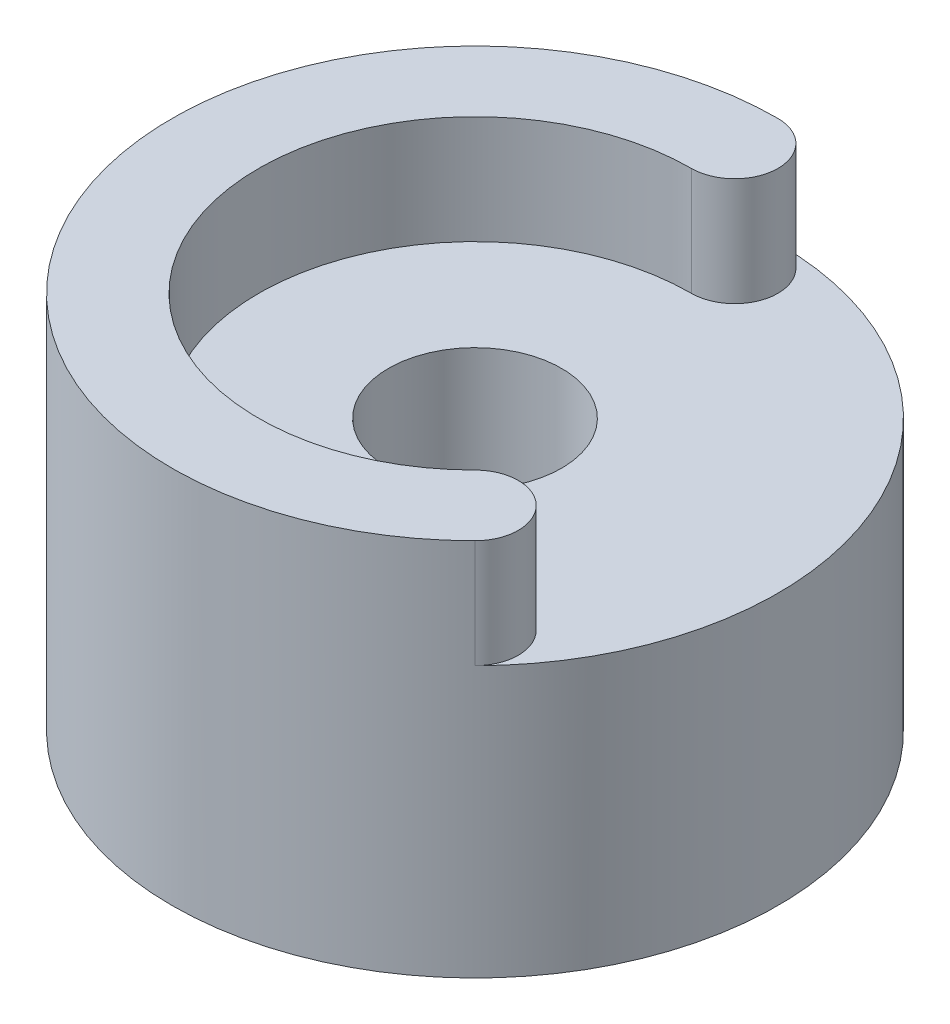
ISO-10303-21;
HEADER;
FILE_DESCRIPTION(('STEP AP214'),'2;1');
FILE_NAME('part.step','',(''),(''),'','','');
FILE_SCHEMA(('AUTOMOTIVE_DESIGN { 1 0 10303 214 1 1 1 1 }'));
ENDSEC;
DATA;
#1=APPLICATION_CONTEXT('core data for automotive mechanical design processes');
#2=APPLICATION_PROTOCOL_DEFINITION('international standard','automotive_design',2000,#1);
#3=PRODUCT_CONTEXT('',#1,'mechanical');
#4=PRODUCT('Part','Part','',(#3));
#5=PRODUCT_RELATED_PRODUCT_CATEGORY('part','',(#4));
#6=PRODUCT_DEFINITION_FORMATION('','',#4);
#7=PRODUCT_DEFINITION_CONTEXT('part definition',#1,'design');
#8=PRODUCT_DEFINITION('design','',#6,#7);
#9=PRODUCT_DEFINITION_SHAPE('','',#8);
#10=(LENGTH_UNIT() NAMED_UNIT(*) SI_UNIT(.MILLI.,.METRE.));
#11=(NAMED_UNIT(*) PLANE_ANGLE_UNIT() SI_UNIT($,.RADIAN.));
#12=(NAMED_UNIT(*) SI_UNIT($,.STERADIAN.) SOLID_ANGLE_UNIT());
#13=UNCERTAINTY_MEASURE_WITH_UNIT(LENGTH_MEASURE(1.E-05),#10,'distance_accuracy_value','');
#14=(GEOMETRIC_REPRESENTATION_CONTEXT(3) GLOBAL_UNCERTAINTY_ASSIGNED_CONTEXT((#13)) GLOBAL_UNIT_ASSIGNED_CONTEXT((#10,
#11,#12)) REPRESENTATION_CONTEXT('',''));
#15=CARTESIAN_POINT('',(0.,0.,0.));
#16=DIRECTION('',(0.,0.,1.));
#17=DIRECTION('',(1.,0.,0.));
#18=AXIS2_PLACEMENT_3D('',#15,#16,#17);
#19=CARTESIAN_POINT('',(0.,12.5,0.));
#20=DIRECTION('',(0.,1.,0.));
#21=DIRECTION('',(0.,0.,1.));
#22=AXIS2_PLACEMENT_3D('',#19,#20,#21);
#23=PLANE('',#22);
#24=CARTESIAN_POINT('',(0.,12.5,-12.));
#25=DIRECTION('',(0.,1.,0.));
#26=DIRECTION('',(0.,0.,1.));
#27=AXIS2_PLACEMENT_3D('',#24,#25,#26);
#28=CIRCLE('',#27,2.);
#29=CARTESIAN_POINT('',(0.,12.5,-10.));
#30=VERTEX_POINT('',#29);
#31=CARTESIAN_POINT('',(0.,12.5,-14.));
#32=VERTEX_POINT('',#31);
#33=EDGE_CURVE('E46',#30,#32,#28,.T.);
#34=ORIENTED_EDGE('',*,*,#33,.F.);
#35=CARTESIAN_POINT('',(0.,12.5,0.));
#36=DIRECTION('',(0.,-1.,0.));
#37=DIRECTION('',(0.,0.,1.));
#38=AXIS2_PLACEMENT_3D('',#35,#36,#37);
#39=CIRCLE('',#38,10.);
#40=CARTESIAN_POINT('',(7.07106781186554,12.5,7.07106781186541));
#41=VERTEX_POINT('',#40);
#42=EDGE_CURVE('E88',#41,#30,#39,.T.);
#43=ORIENTED_EDGE('',*,*,#42,.F.);
#44=CARTESIAN_POINT('',(8.48528137423865,12.5,8.48528137423849));
#45=DIRECTION('',(0.,1.,0.));
#46=DIRECTION('',(0.,0.,1.));
#47=AXIS2_PLACEMENT_3D('',#44,#45,#46);
#48=CIRCLE('',#47,2.);
#49=CARTESIAN_POINT('',(9.89949493661176,12.5,9.89949493661157));
#50=VERTEX_POINT('',#49);
#51=EDGE_CURVE('E176',#50,#41,#48,.T.);
#52=ORIENTED_EDGE('',*,*,#51,.F.);
#53=CARTESIAN_POINT('',(0.,12.5,0.));
#54=DIRECTION('',(0.,1.,0.));
#55=DIRECTION('',(0.,0.,1.));
#56=AXIS2_PLACEMENT_3D('',#53,#54,#55);
#57=CIRCLE('',#56,14.);
#58=EDGE_CURVE('E11',#50,#32,#57,.T.);
#59=ORIENTED_EDGE('',*,*,#58,.T.);
#60=EDGE_LOOP('',(#34,#43,#52,#59));
#61=FACE_BOUND('',#60,.T.);
#62=CARTESIAN_POINT('',(0.,12.5,0.));
#63=DIRECTION('',(0.,1.,0.));
#64=DIRECTION('',(0.,0.,1.));
#65=AXIS2_PLACEMENT_3D('',#62,#63,#64);
#66=CIRCLE('',#65,4.);
#67=CARTESIAN_POINT('',(0.,12.5,4.));
#68=VERTEX_POINT('',#67);
#69=EDGE_CURVE('E94',#68,#68,#66,.T.);
#70=ORIENTED_EDGE('',*,*,#69,.F.);
#71=EDGE_LOOP('',(#70));
#72=FACE_BOUND('',#71,.T.);
#73=ADVANCED_FACE('F32',(#61,#72),#23,.T.);
#74=CARTESIAN_POINT('',(0.,0.,0.));
#75=DIRECTION('',(0.,1.,0.));
#76=DIRECTION('',(0.,0.,1.));
#77=AXIS2_PLACEMENT_3D('',#74,#75,#76);
#78=PLANE('',#77);
#79=CARTESIAN_POINT('',(0.,0.,0.));
#80=DIRECTION('',(0.,1.,0.));
#81=DIRECTION('',(0.,0.,1.));
#82=AXIS2_PLACEMENT_3D('',#79,#80,#81);
#83=CIRCLE('',#82,14.);
#84=CARTESIAN_POINT('',(0.,0.,14.));
#85=VERTEX_POINT('',#84);
#86=EDGE_CURVE('E36',#85,#85,#83,.T.);
#87=ORIENTED_EDGE('',*,*,#86,.F.);
#88=EDGE_LOOP('',(#87));
#89=FACE_BOUND('',#88,.T.);
#90=CARTESIAN_POINT('',(0.,0.,0.));
#91=DIRECTION('',(0.,1.,0.));
#92=DIRECTION('',(0.,0.,1.));
#93=AXIS2_PLACEMENT_3D('',#90,#91,#92);
#94=CIRCLE('',#93,4.);
#95=CARTESIAN_POINT('',(0.,0.,4.));
#96=VERTEX_POINT('',#95);
#97=EDGE_CURVE('E91',#96,#96,#94,.T.);
#98=ORIENTED_EDGE('',*,*,#97,.T.);
#99=EDGE_LOOP('',(#98));
#100=FACE_BOUND('',#99,.T.);
#101=ADVANCED_FACE('F106',(#89,#100),#78,.F.);
#102=CARTESIAN_POINT('',(0.,12.5,0.));
#103=DIRECTION('',(0.,-1.,0.));
#104=DIRECTION('',(0.,0.,-1.));
#105=AXIS2_PLACEMENT_3D('',#102,#103,#104);
#106=CYLINDRICAL_SURFACE('',#105,14.);
#107=ORIENTED_EDGE('',*,*,#58,.F.);
#108=DIRECTION('',(0.,-1.,0.));
#109=VECTOR('',#108,1.);
#110=CARTESIAN_POINT('',(9.89949493661175,17.5,9.89949493661158));
#111=LINE('',#110,#109);
#112=CARTESIAN_POINT('',(9.89949493661175,17.5,9.89949493661158));
#113=VERTEX_POINT('',#112);
#114=EDGE_CURVE('E75',#113,#50,#111,.T.);
#115=ORIENTED_EDGE('',*,*,#114,.F.);
#116=CARTESIAN_POINT('',(0.,17.5,0.));
#117=DIRECTION('',(0.,1.,0.));
#118=DIRECTION('',(0.,0.,1.));
#119=AXIS2_PLACEMENT_3D('',#116,#117,#118);
#120=CIRCLE('',#119,14.);
#121=CARTESIAN_POINT('',(0.,17.5,-14.));
#122=VERTEX_POINT('',#121);
#123=EDGE_CURVE('E69',#122,#113,#120,.T.);
#124=ORIENTED_EDGE('',*,*,#123,.F.);
#125=DIRECTION('',(0.,-1.,0.));
#126=VECTOR('',#125,1.);
#127=CARTESIAN_POINT('',(0.,17.5,-14.));
#128=LINE('',#127,#126);
#129=EDGE_CURVE('E73',#122,#32,#128,.T.);
#130=ORIENTED_EDGE('',*,*,#129,.T.);
#131=EDGE_LOOP('',(#107,#115,#124,#130));
#132=FACE_BOUND('',#131,.T.);
#133=ORIENTED_EDGE('',*,*,#86,.T.);
#134=EDGE_LOOP('',(#133));
#135=FACE_BOUND('',#134,.T.);
#136=ADVANCED_FACE('F34',(#132,#135),#106,.T.);
#137=CARTESIAN_POINT('',(0.,12.5,0.));
#138=DIRECTION('',(0.,-1.,0.));
#139=DIRECTION('',(0.,0.,-1.));
#140=AXIS2_PLACEMENT_3D('',#137,#138,#139);
#141=CYLINDRICAL_SURFACE('',#140,4.);
#142=ORIENTED_EDGE('',*,*,#69,.T.);
#143=EDGE_LOOP('',(#142));
#144=FACE_BOUND('',#143,.T.);
#145=ORIENTED_EDGE('',*,*,#97,.F.);
#146=EDGE_LOOP('',(#145));
#147=FACE_BOUND('',#146,.T.);
#148=ADVANCED_FACE('F111',(#144,#147),#141,.F.);
#149=CARTESIAN_POINT('',(0.,17.5,-12.));
#150=DIRECTION('',(0.,-1.,0.));
#151=DIRECTION('',(0.,0.,-1.));
#152=AXIS2_PLACEMENT_3D('',#149,#150,#151);
#153=CYLINDRICAL_SURFACE('',#152,2.);
#154=ORIENTED_EDGE('',*,*,#33,.T.);
#155=ORIENTED_EDGE('',*,*,#129,.F.);
#156=CARTESIAN_POINT('',(0.,17.5,-12.));
#157=DIRECTION('',(0.,1.,0.));
#158=DIRECTION('',(0.,0.,1.));
#159=AXIS2_PLACEMENT_3D('',#156,#157,#158);
#160=CIRCLE('',#159,2.);
#161=CARTESIAN_POINT('',(0.,17.5,-10.));
#162=VERTEX_POINT('',#161);
#163=EDGE_CURVE('E79',#162,#122,#160,.T.);
#164=ORIENTED_EDGE('',*,*,#163,.F.);
#165=DIRECTION('',(0.,-1.,0.));
#166=VECTOR('',#165,1.);
#167=CARTESIAN_POINT('',(0.,17.5,-10.));
#168=LINE('',#167,#166);
#169=EDGE_CURVE('E173',#162,#30,#168,.T.);
#170=ORIENTED_EDGE('',*,*,#169,.T.);
#171=EDGE_LOOP('',(#154,#155,#164,#170));
#172=FACE_BOUND('',#171,.T.);
#173=ADVANCED_FACE('F90',(#172),#153,.T.);
#174=CARTESIAN_POINT('',(8.48528137423865,17.5,8.48528137423849));
#175=DIRECTION('',(0.,-1.,0.));
#176=DIRECTION('',(0.,0.,-1.));
#177=AXIS2_PLACEMENT_3D('',#174,#175,#176);
#178=CYLINDRICAL_SURFACE('',#177,2.);
#179=ORIENTED_EDGE('',*,*,#51,.T.);
#180=DIRECTION('',(0.,-1.,0.));
#181=VECTOR('',#180,1.);
#182=CARTESIAN_POINT('',(7.07106781186554,17.5,7.07106781186541));
#183=LINE('',#182,#181);
#184=CARTESIAN_POINT('',(7.07106781186554,17.5,7.07106781186541));
#185=VERTEX_POINT('',#184);
#186=EDGE_CURVE('E96',#185,#41,#183,.T.);
#187=ORIENTED_EDGE('',*,*,#186,.F.);
#188=CARTESIAN_POINT('',(8.48528137423865,17.5,8.48528137423849));
#189=DIRECTION('',(0.,1.,0.));
#190=DIRECTION('',(0.,0.,1.));
#191=AXIS2_PLACEMENT_3D('',#188,#189,#190);
#192=CIRCLE('',#191,2.);
#193=EDGE_CURVE('E78',#113,#185,#192,.T.);
#194=ORIENTED_EDGE('',*,*,#193,.F.);
#195=ORIENTED_EDGE('',*,*,#114,.T.);
#196=EDGE_LOOP('',(#179,#187,#194,#195));
#197=FACE_BOUND('',#196,.T.);
#198=ADVANCED_FACE('F118',(#197),#178,.T.);
#199=CARTESIAN_POINT('',(0.,17.5,0.));
#200=DIRECTION('',(0.,-1.,0.));
#201=DIRECTION('',(0.,0.,-1.));
#202=AXIS2_PLACEMENT_3D('',#199,#200,#201);
#203=CYLINDRICAL_SURFACE('',#202,10.);
#204=ORIENTED_EDGE('',*,*,#42,.T.);
#205=ORIENTED_EDGE('',*,*,#169,.F.);
#206=CARTESIAN_POINT('',(0.,17.5,0.));
#207=DIRECTION('',(0.,-1.,0.));
#208=DIRECTION('',(0.,0.,1.));
#209=AXIS2_PLACEMENT_3D('',#206,#207,#208);
#210=CIRCLE('',#209,10.);
#211=EDGE_CURVE('E84',#185,#162,#210,.T.);
#212=ORIENTED_EDGE('',*,*,#211,.F.);
#213=ORIENTED_EDGE('',*,*,#186,.T.);
#214=EDGE_LOOP('',(#204,#205,#212,#213));
#215=FACE_BOUND('',#214,.T.);
#216=ADVANCED_FACE('F150',(#215),#203,.F.);
#217=CARTESIAN_POINT('',(0.,17.5,-6.));
#218=DIRECTION('',(0.,1.,0.));
#219=DIRECTION('',(0.,0.,1.));
#220=AXIS2_PLACEMENT_3D('',#217,#218,#219);
#221=PLANE('',#220);
#222=ORIENTED_EDGE('',*,*,#163,.T.);
#223=ORIENTED_EDGE('',*,*,#123,.T.);
#224=ORIENTED_EDGE('',*,*,#193,.T.);
#225=ORIENTED_EDGE('',*,*,#211,.T.);
#226=EDGE_LOOP('',(#222,#223,#224,#225));
#227=FACE_BOUND('',#226,.T.);
#228=ADVANCED_FACE('F82',(#227),#221,.T.);
#229=CLOSED_SHELL('',(#73,#101,#136,#148,#173,#198,#216,#228));
#230=MANIFOLD_SOLID_BREP('B2',#229);
#231=ADVANCED_BREP_SHAPE_REPRESENTATION('',(#18,#230),#14);
#232=SHAPE_DEFINITION_REPRESENTATION(#9,#231);
ENDSEC;
END-ISO-10303-21;
